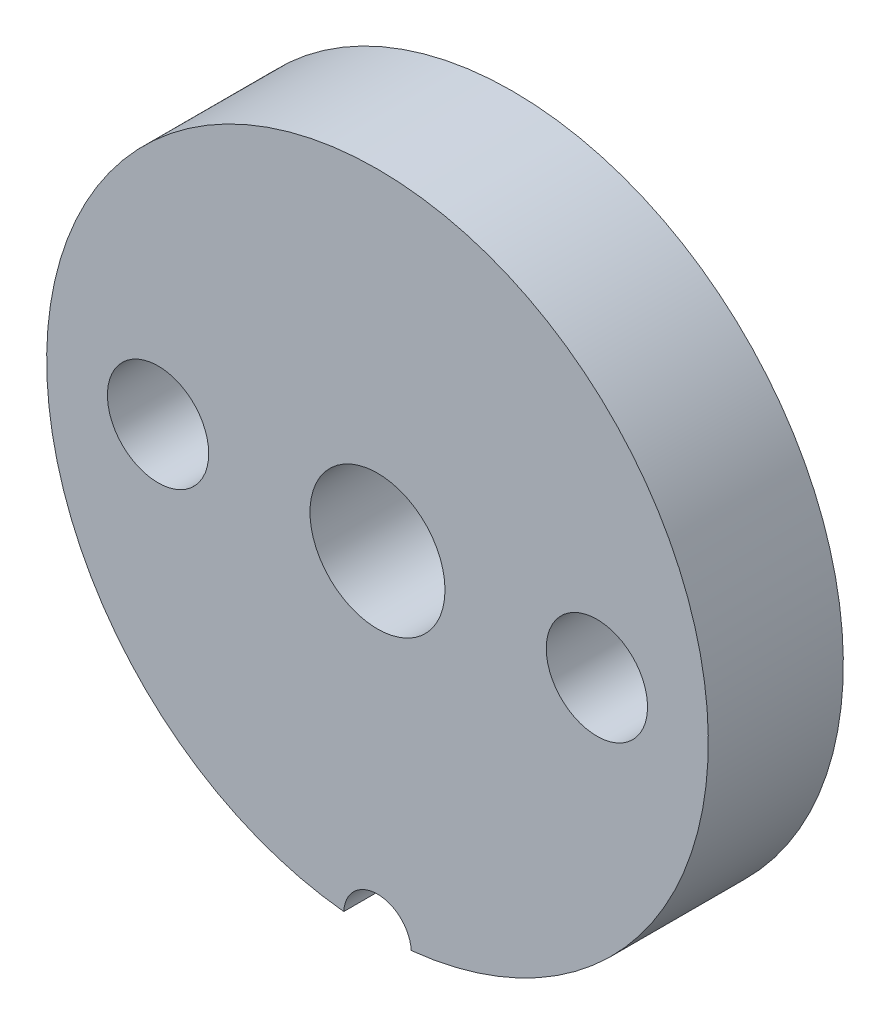
ISO-10303-21;
HEADER;
FILE_DESCRIPTION(('STEP AP214'),'2;1');
FILE_NAME('part.step','',(''),(''),'','','');
FILE_SCHEMA(('AUTOMOTIVE_DESIGN { 1 0 10303 214 1 1 1 1 }'));
ENDSEC;
DATA;
#1=APPLICATION_CONTEXT('core data for automotive mechanical design processes');
#2=APPLICATION_PROTOCOL_DEFINITION('international standard','automotive_design',2000,#1);
#3=PRODUCT_CONTEXT('',#1,'mechanical');
#4=PRODUCT('Part','Part','',(#3));
#5=PRODUCT_RELATED_PRODUCT_CATEGORY('part','',(#4));
#6=PRODUCT_DEFINITION_FORMATION('','',#4);
#7=PRODUCT_DEFINITION_CONTEXT('part definition',#1,'design');
#8=PRODUCT_DEFINITION('design','',#6,#7);
#9=PRODUCT_DEFINITION_SHAPE('','',#8);
#10=(LENGTH_UNIT() NAMED_UNIT(*) SI_UNIT(.MILLI.,.METRE.));
#11=(NAMED_UNIT(*) PLANE_ANGLE_UNIT() SI_UNIT($,.RADIAN.));
#12=(NAMED_UNIT(*) SI_UNIT($,.STERADIAN.) SOLID_ANGLE_UNIT());
#13=UNCERTAINTY_MEASURE_WITH_UNIT(LENGTH_MEASURE(1.E-05),#10,'distance_accuracy_value','');
#14=(GEOMETRIC_REPRESENTATION_CONTEXT(3) GLOBAL_UNCERTAINTY_ASSIGNED_CONTEXT((#13)) GLOBAL_UNIT_ASSIGNED_CONTEXT((#10,
#11,#12)) REPRESENTATION_CONTEXT('',''));
#15=CARTESIAN_POINT('',(0.,0.,0.));
#16=DIRECTION('',(0.,0.,1.));
#17=DIRECTION('',(1.,0.,0.));
#18=AXIS2_PLACEMENT_3D('',#15,#16,#17);
#19=CARTESIAN_POINT('',(0.783567134268554,-3.89178356713428,4.));
#20=DIRECTION('',(0.,0.,1.));
#21=DIRECTION('',(1.,0.,0.));
#22=AXIS2_PLACEMENT_3D('',#19,#20,#21);
#23=PLANE('',#22);
#24=CARTESIAN_POINT('',(0.783567134268554,-13.6917835671343,4.));
#25=DIRECTION('',(0.,0.,1.));
#26=DIRECTION('',(1.,0.,0.));
#27=AXIS2_PLACEMENT_3D('',#24,#25,#26);
#28=CIRCLE('',#27,1.);
#29=CARTESIAN_POINT('',(1.78226474513525,-13.640763158971,4.));
#30=VERTEX_POINT('',#29);
#31=CARTESIAN_POINT('',(-0.215130476598146,-13.640763158971,4.));
#32=VERTEX_POINT('',#31);
#33=EDGE_CURVE('E63',#30,#32,#28,.T.);
#34=ORIENTED_EDGE('',*,*,#33,.F.);
#35=CARTESIAN_POINT('',(0.783567134268554,-3.89178356713428,4.));
#36=DIRECTION('',(0.,0.,1.));
#37=DIRECTION('',(1.,0.,0.));
#38=AXIS2_PLACEMENT_3D('',#35,#36,#37);
#39=CIRCLE('',#38,9.8);
#40=EDGE_CURVE('E69',#30,#32,#39,.T.);
#41=ORIENTED_EDGE('',*,*,#40,.T.);
#42=EDGE_LOOP('',(#34,#41));
#43=FACE_BOUND('',#42,.T.);
#44=CARTESIAN_POINT('',(7.28356713426855,-3.89178356713428,4.));
#45=DIRECTION('',(0.,0.,1.));
#46=DIRECTION('',(-1.,0.,0.));
#47=AXIS2_PLACEMENT_3D('',#44,#45,#46);
#48=CIRCLE('',#47,1.5);
#49=CARTESIAN_POINT('',(5.78356713426855,-3.89178356713428,4.));
#50=VERTEX_POINT('',#49);
#51=EDGE_CURVE('E86',#50,#50,#48,.T.);
#52=ORIENTED_EDGE('',*,*,#51,.F.);
#53=EDGE_LOOP('',(#52));
#54=FACE_BOUND('',#53,.T.);
#55=CARTESIAN_POINT('',(-5.71643286573145,-3.89178356713428,4.));
#56=DIRECTION('',(0.,0.,1.));
#57=DIRECTION('',(1.,0.,0.));
#58=AXIS2_PLACEMENT_3D('',#55,#56,#57);
#59=CIRCLE('',#58,1.5);
#60=CARTESIAN_POINT('',(-4.21643286573145,-3.89178356713428,4.));
#61=VERTEX_POINT('',#60);
#62=EDGE_CURVE('E79',#61,#61,#59,.T.);
#63=ORIENTED_EDGE('',*,*,#62,.F.);
#64=EDGE_LOOP('',(#63));
#65=FACE_BOUND('',#64,.T.);
#66=CARTESIAN_POINT('',(0.783567134268554,-3.89178356713428,4.));
#67=DIRECTION('',(0.,0.,1.));
#68=DIRECTION('',(1.,0.,0.));
#69=AXIS2_PLACEMENT_3D('',#66,#67,#68);
#70=CIRCLE('',#69,2.);
#71=CARTESIAN_POINT('',(2.78356713426855,-3.89178356713428,4.));
#72=VERTEX_POINT('',#71);
#73=EDGE_CURVE('E94',#72,#72,#70,.T.);
#74=ORIENTED_EDGE('',*,*,#73,.F.);
#75=EDGE_LOOP('',(#74));
#76=FACE_BOUND('',#75,.T.);
#77=ADVANCED_FACE('F38',(#43,#54,#65,#76),#23,.T.);
#78=CARTESIAN_POINT('',(0.783567134268554,-3.89178356713428,0.));
#79=DIRECTION('',(0.,0.,1.));
#80=DIRECTION('',(1.,0.,0.));
#81=AXIS2_PLACEMENT_3D('',#78,#79,#80);
#82=PLANE('',#81);
#83=CARTESIAN_POINT('',(0.783567134268554,-3.89178356713428,0.));
#84=DIRECTION('',(0.,0.,1.));
#85=DIRECTION('',(1.,0.,0.));
#86=AXIS2_PLACEMENT_3D('',#83,#84,#85);
#87=CIRCLE('',#86,9.8);
#88=CARTESIAN_POINT('',(1.78226474513526,-13.640763158971,0.));
#89=VERTEX_POINT('',#88);
#90=CARTESIAN_POINT('',(-0.21513047659815,-13.640763158971,0.));
#91=VERTEX_POINT('',#90);
#92=EDGE_CURVE('E76',#89,#91,#87,.T.);
#93=ORIENTED_EDGE('',*,*,#92,.F.);
#94=CARTESIAN_POINT('',(0.783567134268554,-13.6917835671343,0.));
#95=DIRECTION('',(0.,0.,1.));
#96=DIRECTION('',(1.,0.,0.));
#97=AXIS2_PLACEMENT_3D('',#94,#95,#96);
#98=CIRCLE('',#97,1.);
#99=EDGE_CURVE('E54',#89,#91,#98,.T.);
#100=ORIENTED_EDGE('',*,*,#99,.T.);
#101=EDGE_LOOP('',(#93,#100));
#102=FACE_BOUND('',#101,.T.);
#103=CARTESIAN_POINT('',(-5.71643286573145,-3.89178356713428,0.));
#104=DIRECTION('',(0.,0.,1.));
#105=DIRECTION('',(1.,0.,0.));
#106=AXIS2_PLACEMENT_3D('',#103,#104,#105);
#107=CIRCLE('',#106,1.5);
#108=CARTESIAN_POINT('',(-4.21643286573145,-3.89178356713428,0.));
#109=VERTEX_POINT('',#108);
#110=EDGE_CURVE('E82',#109,#109,#107,.T.);
#111=ORIENTED_EDGE('',*,*,#110,.T.);
#112=EDGE_LOOP('',(#111));
#113=FACE_BOUND('',#112,.T.);
#114=CARTESIAN_POINT('',(7.28356713426855,-3.89178356713428,0.));
#115=DIRECTION('',(0.,0.,1.));
#116=DIRECTION('',(-1.,0.,0.));
#117=AXIS2_PLACEMENT_3D('',#114,#115,#116);
#118=CIRCLE('',#117,1.5);
#119=CARTESIAN_POINT('',(5.78356713426855,-3.89178356713428,0.));
#120=VERTEX_POINT('',#119);
#121=EDGE_CURVE('E90',#120,#120,#118,.T.);
#122=ORIENTED_EDGE('',*,*,#121,.T.);
#123=EDGE_LOOP('',(#122));
#124=FACE_BOUND('',#123,.T.);
#125=CARTESIAN_POINT('',(0.783567134268554,-3.89178356713428,0.));
#126=DIRECTION('',(0.,0.,1.));
#127=DIRECTION('',(1.,0.,0.));
#128=AXIS2_PLACEMENT_3D('',#125,#126,#127);
#129=CIRCLE('',#128,2.);
#130=CARTESIAN_POINT('',(2.78356713426855,-3.89178356713428,0.));
#131=VERTEX_POINT('',#130);
#132=EDGE_CURVE('E98',#131,#131,#129,.T.);
#133=ORIENTED_EDGE('',*,*,#132,.T.);
#134=EDGE_LOOP('',(#133));
#135=FACE_BOUND('',#134,.T.);
#136=ADVANCED_FACE('F107',(#102,#113,#124,#135),#82,.F.);
#137=CARTESIAN_POINT('',(0.783567134268554,-3.89178356713428,4.));
#138=DIRECTION('',(0.,0.,-1.));
#139=DIRECTION('',(-1.,0.,0.));
#140=AXIS2_PLACEMENT_3D('',#137,#138,#139);
#141=CYLINDRICAL_SURFACE('',#140,9.8);
#142=ORIENTED_EDGE('',*,*,#92,.T.);
#143=DIRECTION('',(0.,0.,1.));
#144=VECTOR('',#143,1.);
#145=CARTESIAN_POINT('',(-0.215130476598146,-13.640763158971,-1.));
#146=LINE('',#145,#144);
#147=EDGE_CURVE('E11',#91,#32,#146,.T.);
#148=ORIENTED_EDGE('',*,*,#147,.T.);
#149=ORIENTED_EDGE('',*,*,#40,.F.);
#150=DIRECTION('',(0.,0.,1.));
#151=VECTOR('',#150,1.);
#152=CARTESIAN_POINT('',(1.78226474513525,-13.640763158971,-1.));
#153=LINE('',#152,#151);
#154=EDGE_CURVE('E47',#30,#89,#153,.F.);
#155=ORIENTED_EDGE('',*,*,#154,.T.);
#156=EDGE_LOOP('',(#142,#148,#149,#155));
#157=FACE_BOUND('',#156,.T.);
#158=ADVANCED_FACE('F40',(#157),#141,.T.);
#159=CARTESIAN_POINT('',(-5.71643286573145,-3.89178356713428,4.));
#160=DIRECTION('',(0.,0.,-1.));
#161=DIRECTION('',(-1.,0.,0.));
#162=AXIS2_PLACEMENT_3D('',#159,#160,#161);
#163=CYLINDRICAL_SURFACE('',#162,1.5);
#164=ORIENTED_EDGE('',*,*,#62,.T.);
#165=EDGE_LOOP('',(#164));
#166=FACE_BOUND('',#165,.T.);
#167=ORIENTED_EDGE('',*,*,#110,.F.);
#168=EDGE_LOOP('',(#167));
#169=FACE_BOUND('',#168,.T.);
#170=ADVANCED_FACE('F126',(#166,#169),#163,.F.);
#171=CARTESIAN_POINT('',(7.28356713426855,-3.89178356713428,4.));
#172=DIRECTION('',(0.,0.,-1.));
#173=DIRECTION('',(-1.,0.,0.));
#174=AXIS2_PLACEMENT_3D('',#171,#172,#173);
#175=CYLINDRICAL_SURFACE('',#174,1.5);
#176=ORIENTED_EDGE('',*,*,#51,.T.);
#177=EDGE_LOOP('',(#176));
#178=FACE_BOUND('',#177,.T.);
#179=ORIENTED_EDGE('',*,*,#121,.F.);
#180=EDGE_LOOP('',(#179));
#181=FACE_BOUND('',#180,.T.);
#182=ADVANCED_FACE('F118',(#178,#181),#175,.F.);
#183=CARTESIAN_POINT('',(0.783567134268554,-3.89178356713428,4.));
#184=DIRECTION('',(0.,0.,-1.));
#185=DIRECTION('',(-1.,0.,0.));
#186=AXIS2_PLACEMENT_3D('',#183,#184,#185);
#187=CYLINDRICAL_SURFACE('',#186,2.);
#188=ORIENTED_EDGE('',*,*,#73,.T.);
#189=EDGE_LOOP('',(#188));
#190=FACE_BOUND('',#189,.T.);
#191=ORIENTED_EDGE('',*,*,#132,.F.);
#192=EDGE_LOOP('',(#191));
#193=FACE_BOUND('',#192,.T.);
#194=ADVANCED_FACE('F116',(#190,#193),#187,.F.);
#195=CARTESIAN_POINT('',(0.783567134268554,-13.6917835671343,-6.));
#196=DIRECTION('',(0.,0.,1.));
#197=DIRECTION('',(1.,0.,0.));
#198=AXIS2_PLACEMENT_3D('',#195,#196,#197);
#199=CYLINDRICAL_SURFACE('',#198,1.);
#200=ORIENTED_EDGE('',*,*,#99,.F.);
#201=ORIENTED_EDGE('',*,*,#154,.F.);
#202=ORIENTED_EDGE('',*,*,#33,.T.);
#203=ORIENTED_EDGE('',*,*,#147,.F.);
#204=EDGE_LOOP('',(#200,#201,#202,#203));
#205=FACE_BOUND('',#204,.T.);
#206=ADVANCED_FACE('F62',(#205),#199,.F.);
#207=CLOSED_SHELL('',(#77,#136,#158,#170,#182,#194,#206));
#208=MANIFOLD_SOLID_BREP('B2',#207);
#209=ADVANCED_BREP_SHAPE_REPRESENTATION('',(#18,#208),#14);
#210=SHAPE_DEFINITION_REPRESENTATION(#9,#209);
ENDSEC;
END-ISO-10303-21;
